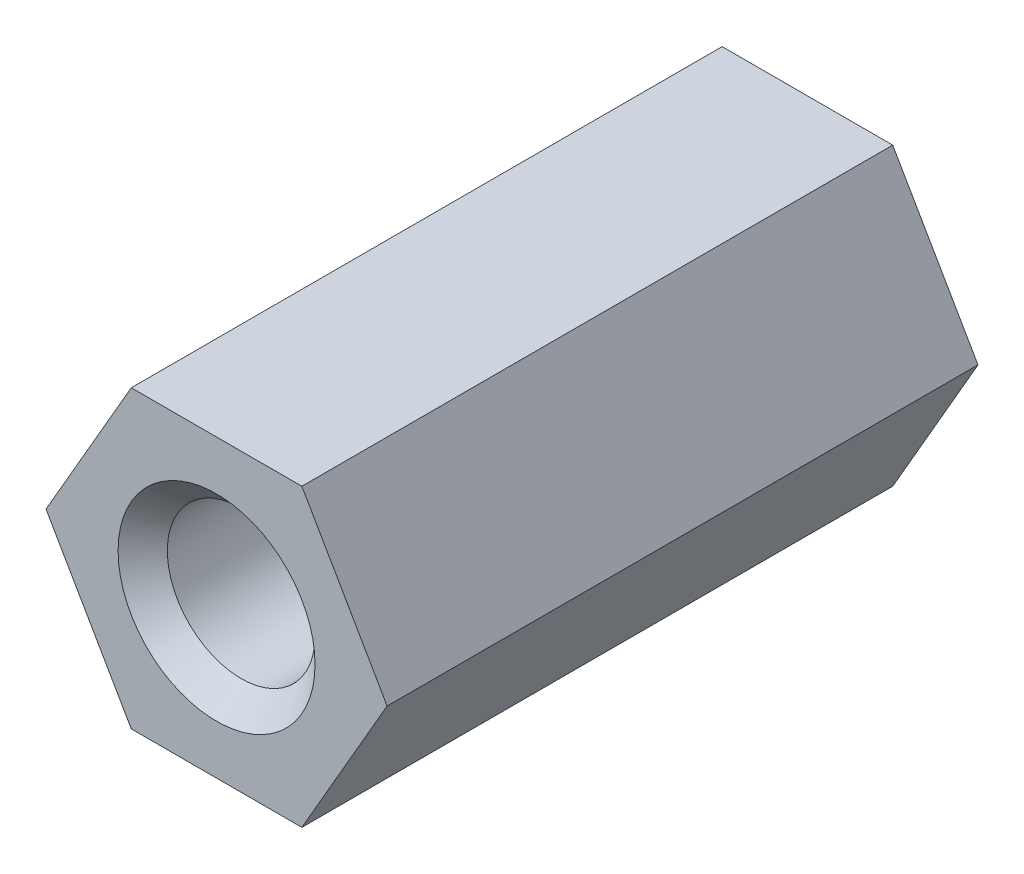
ISO-10303-21;
HEADER;
FILE_DESCRIPTION(('STEP AP214'),'2;1');
FILE_NAME('part.step','',(''),(''),'','','');
FILE_SCHEMA(('AUTOMOTIVE_DESIGN { 1 0 10303 214 1 1 1 1 }'));
ENDSEC;
DATA;
#1=APPLICATION_CONTEXT('core data for automotive mechanical design processes');
#2=APPLICATION_PROTOCOL_DEFINITION('international standard','automotive_design',2000,#1);
#3=PRODUCT_CONTEXT('',#1,'mechanical');
#4=PRODUCT('Part','Part','',(#3));
#5=PRODUCT_RELATED_PRODUCT_CATEGORY('part','',(#4));
#6=PRODUCT_DEFINITION_FORMATION('','',#4);
#7=PRODUCT_DEFINITION_CONTEXT('part definition',#1,'design');
#8=PRODUCT_DEFINITION('design','',#6,#7);
#9=PRODUCT_DEFINITION_SHAPE('','',#8);
#10=(LENGTH_UNIT() NAMED_UNIT(*) SI_UNIT(.MILLI.,.METRE.));
#11=(NAMED_UNIT(*) PLANE_ANGLE_UNIT() SI_UNIT($,.RADIAN.));
#12=(NAMED_UNIT(*) SI_UNIT($,.STERADIAN.) SOLID_ANGLE_UNIT());
#13=UNCERTAINTY_MEASURE_WITH_UNIT(LENGTH_MEASURE(1.E-05),#10,'distance_accuracy_value','');
#14=(GEOMETRIC_REPRESENTATION_CONTEXT(3) GLOBAL_UNCERTAINTY_ASSIGNED_CONTEXT((#13)) GLOBAL_UNIT_ASSIGNED_CONTEXT((#10,
#11,#12)) REPRESENTATION_CONTEXT('',''));
#15=CARTESIAN_POINT('',(0.,0.,0.));
#16=DIRECTION('',(0.,0.,1.));
#17=DIRECTION('',(1.,0.,0.));
#18=AXIS2_PLACEMENT_3D('',#15,#16,#17);
#19=CARTESIAN_POINT('',(0.,0.,6.));
#20=DIRECTION('',(0.,0.,1.));
#21=DIRECTION('',(1.,0.,0.));
#22=AXIS2_PLACEMENT_3D('',#19,#20,#21);
#23=PLANE('',#22);
#24=CARTESIAN_POINT('',(0.,0.,6.));
#25=DIRECTION('',(0.,0.,1.));
#26=DIRECTION('',(1.,0.,0.));
#27=AXIS2_PLACEMENT_3D('',#24,#25,#26);
#28=CIRCLE('',#27,2.);
#29=CARTESIAN_POINT('',(2.,0.,6.));
#30=VERTEX_POINT('',#29);
#31=EDGE_CURVE('E11',#30,#30,#28,.F.);
#32=ORIENTED_EDGE('',*,*,#31,.T.);
#33=EDGE_LOOP('',(#32));
#34=FACE_BOUND('',#33,.T.);
#35=DIRECTION('',(0.499999999999995,0.866025403784441,0.));
#36=VECTOR('',#35,1.);
#37=CARTESIAN_POINT('',(1.73205080756892,-2.99999999999999,6.));
#38=LINE('',#37,#36);
#39=CARTESIAN_POINT('',(1.73205080756892,-2.99999999999999,6.));
#40=VERTEX_POINT('',#39);
#41=CARTESIAN_POINT('',(3.46410161513776,0.,6.));
#42=VERTEX_POINT('',#41);
#43=EDGE_CURVE('E129',#40,#42,#38,.T.);
#44=ORIENTED_EDGE('',*,*,#43,.T.);
#45=DIRECTION('',(-0.500000000000001,0.866025403784438,0.));
#46=VECTOR('',#45,1.);
#47=CARTESIAN_POINT('',(3.46410161513776,0.,6.));
#48=LINE('',#47,#46);
#49=CARTESIAN_POINT('',(1.73205080756887,3.00000000000001,6.));
#50=VERTEX_POINT('',#49);
#51=EDGE_CURVE('E88',#42,#50,#48,.T.);
#52=ORIENTED_EDGE('',*,*,#51,.T.);
#53=DIRECTION('',(-1.,0.,0.));
#54=VECTOR('',#53,1.);
#55=CARTESIAN_POINT('',(1.73205080756887,3.00000000000001,6.));
#56=LINE('',#55,#54);
#57=CARTESIAN_POINT('',(-1.7320508075689,3.,6.));
#58=VERTEX_POINT('',#57);
#59=EDGE_CURVE('E100',#50,#58,#56,.T.);
#60=ORIENTED_EDGE('',*,*,#59,.T.);
#61=DIRECTION('',(-0.499999999999995,-0.866025403784441,0.));
#62=VECTOR('',#61,1.);
#63=CARTESIAN_POINT('',(-1.7320508075689,3.,6.));
#64=LINE('',#63,#62);
#65=CARTESIAN_POINT('',(-3.46410161513776,0.,6.));
#66=VERTEX_POINT('',#65);
#67=EDGE_CURVE('E95',#58,#66,#64,.T.);
#68=ORIENTED_EDGE('',*,*,#67,.T.);
#69=DIRECTION('',(0.500000000000007,-0.866025403784434,0.));
#70=VECTOR('',#69,1.);
#71=CARTESIAN_POINT('',(-3.46410161513776,0.,6.));
#72=LINE('',#71,#70);
#73=CARTESIAN_POINT('',(-1.73205080756885,-3.00000000000002,6.));
#74=VERTEX_POINT('',#73);
#75=EDGE_CURVE('E98',#66,#74,#72,.T.);
#76=ORIENTED_EDGE('',*,*,#75,.T.);
#77=DIRECTION('',(1.,0.,0.));
#78=VECTOR('',#77,1.);
#79=CARTESIAN_POINT('',(-1.73205080756885,-3.00000000000002,6.));
#80=LINE('',#79,#78);
#81=EDGE_CURVE('E50',#74,#40,#80,.T.);
#82=ORIENTED_EDGE('',*,*,#81,.T.);
#83=EDGE_LOOP('',(#44,#52,#60,#68,#76,#82));
#84=FACE_BOUND('',#83,.T.);
#85=ADVANCED_FACE('F33',(#34,#84),#23,.T.);
#86=CARTESIAN_POINT('',(0.,0.,-6.));
#87=DIRECTION('',(0.,0.,1.));
#88=DIRECTION('',(1.,0.,0.));
#89=AXIS2_PLACEMENT_3D('',#86,#87,#88);
#90=PLANE('',#89);
#91=DIRECTION('',(0.499999999999995,0.866025403784441,0.));
#92=VECTOR('',#91,1.);
#93=CARTESIAN_POINT('',(1.73205080756892,-2.99999999999999,-6.));
#94=LINE('',#93,#92);
#95=CARTESIAN_POINT('',(1.73205080756892,-2.99999999999999,-6.));
#96=VERTEX_POINT('',#95);
#97=CARTESIAN_POINT('',(3.46410161513776,0.,-6.));
#98=VERTEX_POINT('',#97);
#99=EDGE_CURVE('E118',#96,#98,#94,.T.);
#100=ORIENTED_EDGE('',*,*,#99,.F.);
#101=DIRECTION('',(1.,0.,0.));
#102=VECTOR('',#101,1.);
#103=CARTESIAN_POINT('',(-1.73205080756885,-3.00000000000002,-6.));
#104=LINE('',#103,#102);
#105=CARTESIAN_POINT('',(-1.73205080756885,-3.00000000000002,-6.));
#106=VERTEX_POINT('',#105);
#107=EDGE_CURVE('E79',#106,#96,#104,.T.);
#108=ORIENTED_EDGE('',*,*,#107,.F.);
#109=DIRECTION('',(0.500000000000007,-0.866025403784434,0.));
#110=VECTOR('',#109,1.);
#111=CARTESIAN_POINT('',(-3.46410161513776,0.,-6.));
#112=LINE('',#111,#110);
#113=CARTESIAN_POINT('',(-3.46410161513776,0.,-6.));
#114=VERTEX_POINT('',#113);
#115=EDGE_CURVE('E73',#114,#106,#112,.T.);
#116=ORIENTED_EDGE('',*,*,#115,.F.);
#117=DIRECTION('',(-0.499999999999995,-0.866025403784441,0.));
#118=VECTOR('',#117,1.);
#119=CARTESIAN_POINT('',(-1.7320508075689,3.,-6.));
#120=LINE('',#119,#118);
#121=CARTESIAN_POINT('',(-1.7320508075689,3.,-6.));
#122=VERTEX_POINT('',#121);
#123=EDGE_CURVE('E108',#122,#114,#120,.T.);
#124=ORIENTED_EDGE('',*,*,#123,.F.);
#125=DIRECTION('',(-1.,0.,0.));
#126=VECTOR('',#125,1.);
#127=CARTESIAN_POINT('',(1.73205080756887,3.00000000000001,-6.));
#128=LINE('',#127,#126);
#129=CARTESIAN_POINT('',(1.73205080756887,3.00000000000001,-6.));
#130=VERTEX_POINT('',#129);
#131=EDGE_CURVE('E124',#130,#122,#128,.T.);
#132=ORIENTED_EDGE('',*,*,#131,.F.);
#133=DIRECTION('',(-0.500000000000001,0.866025403784438,0.));
#134=VECTOR('',#133,1.);
#135=CARTESIAN_POINT('',(3.46410161513776,0.,-6.));
#136=LINE('',#135,#134);
#137=EDGE_CURVE('E121',#98,#130,#136,.T.);
#138=ORIENTED_EDGE('',*,*,#137,.F.);
#139=EDGE_LOOP('',(#100,#108,#116,#124,#132,#138));
#140=FACE_BOUND('',#139,.T.);
#141=CARTESIAN_POINT('',(0.,0.,-6.));
#142=DIRECTION('',(0.,0.,1.));
#143=DIRECTION('',(1.,0.,0.));
#144=AXIS2_PLACEMENT_3D('',#141,#142,#143);
#145=CIRCLE('',#144,1.5);
#146=CARTESIAN_POINT('',(1.5,0.,-6.));
#147=VERTEX_POINT('',#146);
#148=EDGE_CURVE('E122',#147,#147,#145,.T.);
#149=ORIENTED_EDGE('',*,*,#148,.T.);
#150=EDGE_LOOP('',(#149));
#151=FACE_BOUND('',#150,.T.);
#152=ADVANCED_FACE('F152',(#140,#151),#90,.F.);
#153=CARTESIAN_POINT('',(1.73205080756892,-2.99999999999999,6.));
#154=DIRECTION('',(-0.866025403784442,0.499999999999995,0.));
#155=DIRECTION('',(-0.499999999999995,-0.866025403784442,0.));
#156=AXIS2_PLACEMENT_3D('',#153,#154,#155);
#157=PLANE('',#156);
#158=ORIENTED_EDGE('',*,*,#99,.T.);
#159=DIRECTION('',(0.,0.,-1.));
#160=VECTOR('',#159,1.);
#161=CARTESIAN_POINT('',(3.46410161513776,0.,6.));
#162=LINE('',#161,#160);
#163=EDGE_CURVE('E136',#42,#98,#162,.T.);
#164=ORIENTED_EDGE('',*,*,#163,.F.);
#165=ORIENTED_EDGE('',*,*,#43,.F.);
#166=DIRECTION('',(0.,0.,-1.));
#167=VECTOR('',#166,1.);
#168=CARTESIAN_POINT('',(1.73205080756892,-2.99999999999999,6.));
#169=LINE('',#168,#167);
#170=EDGE_CURVE('E114',#40,#96,#169,.T.);
#171=ORIENTED_EDGE('',*,*,#170,.T.);
#172=EDGE_LOOP('',(#158,#164,#165,#171));
#173=FACE_BOUND('',#172,.T.);
#174=ADVANCED_FACE('F158',(#173),#157,.F.);
#175=CARTESIAN_POINT('',(3.46410161513776,0.,6.));
#176=DIRECTION('',(-0.866025403784438,-0.500000000000001,0.));
#177=DIRECTION('',(0.500000000000001,-0.866025403784438,0.));
#178=AXIS2_PLACEMENT_3D('',#175,#176,#177);
#179=PLANE('',#178);
#180=ORIENTED_EDGE('',*,*,#137,.T.);
#181=DIRECTION('',(0.,0.,-1.));
#182=VECTOR('',#181,1.);
#183=CARTESIAN_POINT('',(1.73205080756887,3.00000000000001,6.));
#184=LINE('',#183,#182);
#185=EDGE_CURVE('E133',#50,#130,#184,.T.);
#186=ORIENTED_EDGE('',*,*,#185,.F.);
#187=ORIENTED_EDGE('',*,*,#51,.F.);
#188=ORIENTED_EDGE('',*,*,#163,.T.);
#189=EDGE_LOOP('',(#180,#186,#187,#188));
#190=FACE_BOUND('',#189,.T.);
#191=ADVANCED_FACE('F171',(#190),#179,.F.);
#192=CARTESIAN_POINT('',(1.73205080756887,3.00000000000001,6.));
#193=DIRECTION('',(0.,-1.,0.));
#194=DIRECTION('',(1.,0.,0.));
#195=AXIS2_PLACEMENT_3D('',#192,#193,#194);
#196=PLANE('',#195);
#197=ORIENTED_EDGE('',*,*,#131,.T.);
#198=DIRECTION('',(0.,0.,-1.));
#199=VECTOR('',#198,1.);
#200=CARTESIAN_POINT('',(-1.7320508075689,3.,6.));
#201=LINE('',#200,#199);
#202=EDGE_CURVE('E109',#58,#122,#201,.T.);
#203=ORIENTED_EDGE('',*,*,#202,.F.);
#204=ORIENTED_EDGE('',*,*,#59,.F.);
#205=ORIENTED_EDGE('',*,*,#185,.T.);
#206=EDGE_LOOP('',(#197,#203,#204,#205));
#207=FACE_BOUND('',#206,.T.);
#208=ADVANCED_FACE('F168',(#207),#196,.F.);
#209=CARTESIAN_POINT('',(-1.7320508075689,3.,6.));
#210=DIRECTION('',(0.866025403784441,-0.499999999999995,0.));
#211=DIRECTION('',(0.499999999999995,0.866025403784441,0.));
#212=AXIS2_PLACEMENT_3D('',#209,#210,#211);
#213=PLANE('',#212);
#214=ORIENTED_EDGE('',*,*,#123,.T.);
#215=DIRECTION('',(0.,0.,-1.));
#216=VECTOR('',#215,1.);
#217=CARTESIAN_POINT('',(-3.46410161513776,0.,6.));
#218=LINE('',#217,#216);
#219=EDGE_CURVE('E105',#66,#114,#218,.T.);
#220=ORIENTED_EDGE('',*,*,#219,.F.);
#221=ORIENTED_EDGE('',*,*,#67,.F.);
#222=ORIENTED_EDGE('',*,*,#202,.T.);
#223=EDGE_LOOP('',(#214,#220,#221,#222));
#224=FACE_BOUND('',#223,.T.);
#225=ADVANCED_FACE('F106',(#224),#213,.F.);
#226=CARTESIAN_POINT('',(-3.46410161513776,0.,6.));
#227=DIRECTION('',(0.866025403784435,0.500000000000007,0.));
#228=DIRECTION('',(-0.500000000000007,0.866025403784434,0.));
#229=AXIS2_PLACEMENT_3D('',#226,#227,#228);
#230=PLANE('',#229);
#231=ORIENTED_EDGE('',*,*,#115,.T.);
#232=DIRECTION('',(0.,0.,-1.));
#233=VECTOR('',#232,1.);
#234=CARTESIAN_POINT('',(-1.73205080756885,-3.00000000000002,6.));
#235=LINE('',#234,#233);
#236=EDGE_CURVE('E110',#74,#106,#235,.T.);
#237=ORIENTED_EDGE('',*,*,#236,.F.);
#238=ORIENTED_EDGE('',*,*,#75,.F.);
#239=ORIENTED_EDGE('',*,*,#219,.T.);
#240=EDGE_LOOP('',(#231,#237,#238,#239));
#241=FACE_BOUND('',#240,.T.);
#242=ADVANCED_FACE('F112',(#241),#230,.F.);
#243=CARTESIAN_POINT('',(-1.73205080756885,-3.00000000000002,6.));
#244=DIRECTION('',(0.,1.,0.));
#245=DIRECTION('',(-1.,0.,0.));
#246=AXIS2_PLACEMENT_3D('',#243,#244,#245);
#247=PLANE('',#246);
#248=ORIENTED_EDGE('',*,*,#107,.T.);
#249=ORIENTED_EDGE('',*,*,#170,.F.);
#250=ORIENTED_EDGE('',*,*,#81,.F.);
#251=ORIENTED_EDGE('',*,*,#236,.T.);
#252=EDGE_LOOP('',(#248,#249,#250,#251));
#253=FACE_BOUND('',#252,.T.);
#254=ADVANCED_FACE('F148',(#253),#247,.F.);
#255=CARTESIAN_POINT('',(0.,0.,6.));
#256=DIRECTION('',(0.,0.,-1.));
#257=DIRECTION('',(-1.,0.,0.));
#258=AXIS2_PLACEMENT_3D('',#255,#256,#257);
#259=CYLINDRICAL_SURFACE('',#258,1.5);
#260=CARTESIAN_POINT('',(0.,0.,5.5));
#261=DIRECTION('',(0.,0.,1.));
#262=DIRECTION('',(1.,0.,0.));
#263=AXIS2_PLACEMENT_3D('',#260,#261,#262);
#264=CIRCLE('',#263,1.5);
#265=CARTESIAN_POINT('',(1.5,0.,5.5));
#266=VERTEX_POINT('',#265);
#267=EDGE_CURVE('E42',#266,#266,#264,.T.);
#268=ORIENTED_EDGE('',*,*,#267,.T.);
#269=EDGE_LOOP('',(#268));
#270=FACE_BOUND('',#269,.T.);
#271=ORIENTED_EDGE('',*,*,#148,.F.);
#272=EDGE_LOOP('',(#271));
#273=FACE_BOUND('',#272,.T.);
#274=ADVANCED_FACE('F140',(#270,#273),#259,.F.);
#275=CARTESIAN_POINT('',(0.,0.,5.5));
#276=DIRECTION('',(0.,0.,1.));
#277=DIRECTION('',(1.,0.,0.));
#278=AXIS2_PLACEMENT_3D('',#275,#276,#277);
#279=CONICAL_SURFACE('',#278,1.5,0.785398163397449);
#280=ORIENTED_EDGE('',*,*,#31,.F.);
#281=EDGE_LOOP('',(#280));
#282=FACE_BOUND('',#281,.T.);
#283=ORIENTED_EDGE('',*,*,#267,.F.);
#284=EDGE_LOOP('',(#283));
#285=FACE_BOUND('',#284,.T.);
#286=ADVANCED_FACE('F35',(#282,#285),#279,.F.);
#287=CLOSED_SHELL('',(#85,#152,#174,#191,#208,#225,#242,#254,#274,#286));
#288=MANIFOLD_SOLID_BREP('B2',#287);
#289=ADVANCED_BREP_SHAPE_REPRESENTATION('',(#18,#288),#14);
#290=SHAPE_DEFINITION_REPRESENTATION(#9,#289);
ENDSEC;
END-ISO-10303-21;
